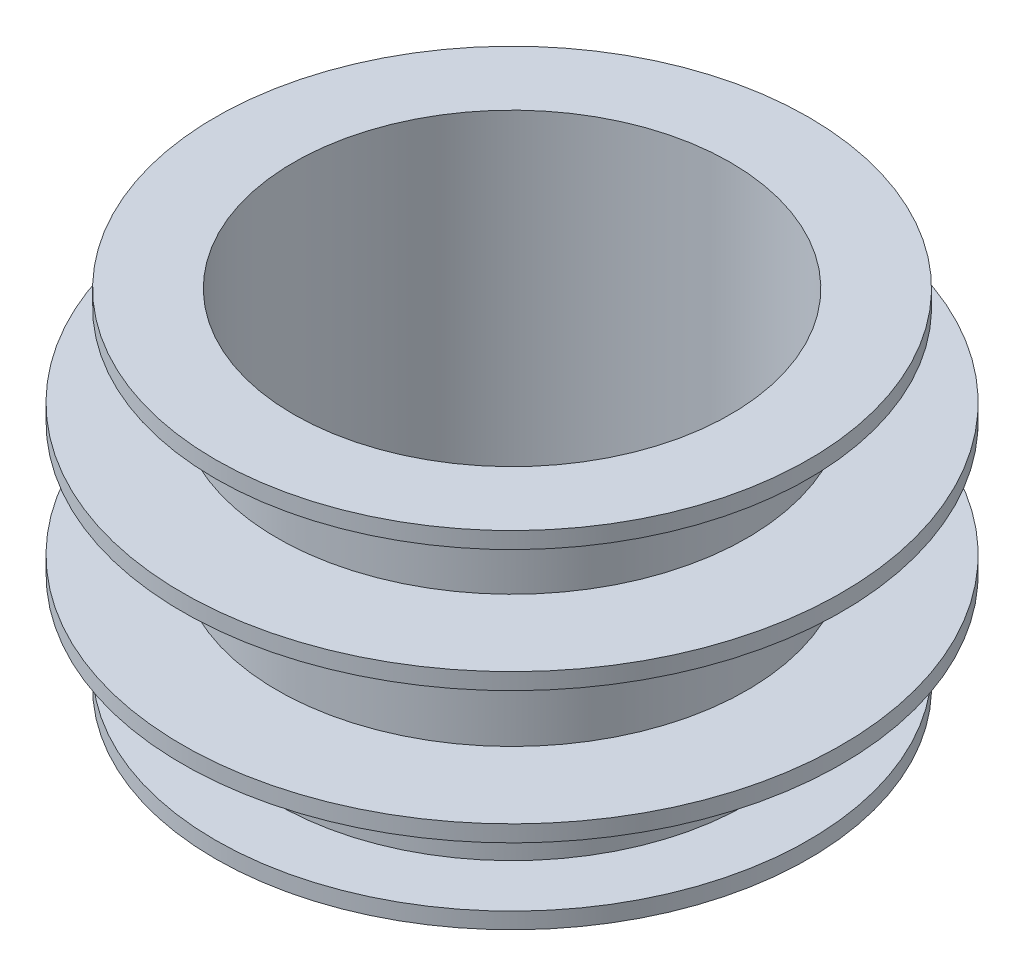
ISO-10303-21;
HEADER;
FILE_DESCRIPTION(('STEP AP214'),'2;1');
FILE_NAME('part.step','',(''),(''),'','','');
FILE_SCHEMA(('AUTOMOTIVE_DESIGN { 1 0 10303 214 1 1 1 1 }'));
ENDSEC;
DATA;
#1=APPLICATION_CONTEXT('core data for automotive mechanical design processes');
#2=APPLICATION_PROTOCOL_DEFINITION('international standard','automotive_design',2000,#1);
#3=PRODUCT_CONTEXT('',#1,'mechanical');
#4=PRODUCT('Part','Part','',(#3));
#5=PRODUCT_RELATED_PRODUCT_CATEGORY('part','',(#4));
#6=PRODUCT_DEFINITION_FORMATION('','',#4);
#7=PRODUCT_DEFINITION_CONTEXT('part definition',#1,'design');
#8=PRODUCT_DEFINITION('design','',#6,#7);
#9=PRODUCT_DEFINITION_SHAPE('','',#8);
#10=(LENGTH_UNIT() NAMED_UNIT(*) SI_UNIT(.MILLI.,.METRE.));
#11=(NAMED_UNIT(*) PLANE_ANGLE_UNIT() SI_UNIT($,.RADIAN.));
#12=(NAMED_UNIT(*) SI_UNIT($,.STERADIAN.) SOLID_ANGLE_UNIT());
#13=UNCERTAINTY_MEASURE_WITH_UNIT(LENGTH_MEASURE(1.E-05),#10,'distance_accuracy_value','');
#14=(GEOMETRIC_REPRESENTATION_CONTEXT(3) GLOBAL_UNCERTAINTY_ASSIGNED_CONTEXT((#13)) GLOBAL_UNIT_ASSIGNED_CONTEXT((#10,
#11,#12)) REPRESENTATION_CONTEXT('',''));
#15=CARTESIAN_POINT('',(0.,0.,0.));
#16=DIRECTION('',(0.,0.,1.));
#17=DIRECTION('',(1.,0.,0.));
#18=AXIS2_PLACEMENT_3D('',#15,#16,#17);
#19=CARTESIAN_POINT('',(11.881076893319,20.9799405329486,0.));
#20=DIRECTION('',(0.,1.,0.));
#21=DIRECTION('',(0.,0.,1.));
#22=AXIS2_PLACEMENT_3D('',#19,#20,#21);
#23=PLANE('',#22);
#24=CARTESIAN_POINT('',(0.,20.9799405329486,0.));
#25=DIRECTION('',(0.,1.,0.));
#26=DIRECTION('',(0.,0.,1.));
#27=AXIS2_PLACEMENT_3D('',#24,#25,#26);
#28=CIRCLE('',#27,13.25);
#29=CARTESIAN_POINT('',(0.,20.9799405329486,13.25));
#30=VERTEX_POINT('',#29);
#31=EDGE_CURVE('E107',#30,#30,#28,.T.);
#32=ORIENTED_EDGE('',*,*,#31,.F.);
#33=EDGE_LOOP('',(#32));
#34=FACE_BOUND('',#33,.T.);
#35=CARTESIAN_POINT('',(0.,20.9799405329486,0.));
#36=DIRECTION('',(0.,-1.,0.));
#37=DIRECTION('',(0.,0.,-1.));
#38=AXIS2_PLACEMENT_3D('',#35,#36,#37);
#39=CIRCLE('',#38,18.);
#40=CARTESIAN_POINT('',(0.,20.9799405329486,-18.));
#41=VERTEX_POINT('',#40);
#42=EDGE_CURVE('E10',#41,#41,#39,.T.);
#43=ORIENTED_EDGE('',*,*,#42,.F.);
#44=EDGE_LOOP('',(#43));
#45=FACE_BOUND('',#44,.T.);
#46=ADVANCED_FACE('F43',(#34,#45),#23,.T.);
#47=CARTESIAN_POINT('',(0.,0.,0.));
#48=DIRECTION('',(0.,-1.,0.));
#49=DIRECTION('',(0.,0.,-1.));
#50=AXIS2_PLACEMENT_3D('',#47,#48,#49);
#51=CYLINDRICAL_SURFACE('',#50,18.);
#52=ORIENTED_EDGE('',*,*,#42,.T.);
#53=EDGE_LOOP('',(#52));
#54=FACE_BOUND('',#53,.T.);
#55=CARTESIAN_POINT('',(0.,19.9799405329486,0.));
#56=DIRECTION('',(0.,-1.,0.));
#57=DIRECTION('',(0.,0.,-1.));
#58=AXIS2_PLACEMENT_3D('',#55,#56,#57);
#59=CIRCLE('',#58,18.);
#60=CARTESIAN_POINT('',(0.,19.9799405329486,-18.));
#61=VERTEX_POINT('',#60);
#62=EDGE_CURVE('E50',#61,#61,#59,.T.);
#63=ORIENTED_EDGE('',*,*,#62,.F.);
#64=EDGE_LOOP('',(#63));
#65=FACE_BOUND('',#64,.T.);
#66=ADVANCED_FACE('F126',(#54,#65),#51,.T.);
#67=CARTESIAN_POINT('',(18.,19.9799405329486,0.));
#68=DIRECTION('',(0.,-1.,0.));
#69=DIRECTION('',(0.,0.,-1.));
#70=AXIS2_PLACEMENT_3D('',#67,#68,#69);
#71=PLANE('',#70);
#72=ORIENTED_EDGE('',*,*,#62,.T.);
#73=EDGE_LOOP('',(#72));
#74=FACE_BOUND('',#73,.T.);
#75=CARTESIAN_POINT('',(0.,19.9799405329486,0.));
#76=DIRECTION('',(0.,-1.,0.));
#77=DIRECTION('',(0.,0.,-1.));
#78=AXIS2_PLACEMENT_3D('',#75,#76,#77);
#79=CIRCLE('',#78,14.25);
#80=CARTESIAN_POINT('',(0.,19.9799405329486,-14.25));
#81=VERTEX_POINT('',#80);
#82=EDGE_CURVE('E55',#81,#81,#79,.T.);
#83=ORIENTED_EDGE('',*,*,#82,.F.);
#84=EDGE_LOOP('',(#83));
#85=FACE_BOUND('',#84,.T.);
#86=ADVANCED_FACE('F132',(#74,#85),#71,.T.);
#87=CARTESIAN_POINT('',(0.,0.,0.));
#88=DIRECTION('',(0.,-1.,0.));
#89=DIRECTION('',(0.,0.,-1.));
#90=AXIS2_PLACEMENT_3D('',#87,#88,#89);
#91=CYLINDRICAL_SURFACE('',#90,14.25);
#92=ORIENTED_EDGE('',*,*,#82,.T.);
#93=EDGE_LOOP('',(#92));
#94=FACE_BOUND('',#93,.T.);
#95=CARTESIAN_POINT('',(0.,14.9799405329486,0.));
#96=DIRECTION('',(0.,-1.,0.));
#97=DIRECTION('',(0.,0.,-1.));
#98=AXIS2_PLACEMENT_3D('',#95,#96,#97);
#99=CIRCLE('',#98,14.25);
#100=CARTESIAN_POINT('',(0.,14.9799405329486,-14.25));
#101=VERTEX_POINT('',#100);
#102=EDGE_CURVE('E60',#101,#101,#99,.T.);
#103=ORIENTED_EDGE('',*,*,#102,.F.);
#104=EDGE_LOOP('',(#103));
#105=FACE_BOUND('',#104,.T.);
#106=ADVANCED_FACE('F136',(#94,#105),#91,.T.);
#107=CARTESIAN_POINT('',(14.25,14.9799405329486,0.));
#108=DIRECTION('',(0.,1.,0.));
#109=DIRECTION('',(0.,0.,1.));
#110=AXIS2_PLACEMENT_3D('',#107,#108,#109);
#111=PLANE('',#110);
#112=ORIENTED_EDGE('',*,*,#102,.T.);
#113=EDGE_LOOP('',(#112));
#114=FACE_BOUND('',#113,.T.);
#115=CARTESIAN_POINT('',(0.,14.9799405329486,0.));
#116=DIRECTION('',(0.,-1.,0.));
#117=DIRECTION('',(0.,0.,-1.));
#118=AXIS2_PLACEMENT_3D('',#115,#116,#117);
#119=CIRCLE('',#118,20.);
#120=CARTESIAN_POINT('',(0.,14.9799405329486,-20.));
#121=VERTEX_POINT('',#120);
#122=EDGE_CURVE('E66',#121,#121,#119,.T.);
#123=ORIENTED_EDGE('',*,*,#122,.F.);
#124=EDGE_LOOP('',(#123));
#125=FACE_BOUND('',#124,.T.);
#126=ADVANCED_FACE('F142',(#114,#125),#111,.T.);
#127=CARTESIAN_POINT('',(0.,0.,0.));
#128=DIRECTION('',(0.,-1.,0.));
#129=DIRECTION('',(0.,0.,-1.));
#130=AXIS2_PLACEMENT_3D('',#127,#128,#129);
#131=CYLINDRICAL_SURFACE('',#130,20.);
#132=ORIENTED_EDGE('',*,*,#122,.T.);
#133=EDGE_LOOP('',(#132));
#134=FACE_BOUND('',#133,.T.);
#135=CARTESIAN_POINT('',(0.,13.9799405329486,0.));
#136=DIRECTION('',(0.,-1.,0.));
#137=DIRECTION('',(0.,0.,-1.));
#138=AXIS2_PLACEMENT_3D('',#135,#136,#137);
#139=CIRCLE('',#138,20.);
#140=CARTESIAN_POINT('',(0.,13.9799405329486,-20.));
#141=VERTEX_POINT('',#140);
#142=EDGE_CURVE('E70',#141,#141,#139,.T.);
#143=ORIENTED_EDGE('',*,*,#142,.F.);
#144=EDGE_LOOP('',(#143));
#145=FACE_BOUND('',#144,.T.);
#146=ADVANCED_FACE('F146',(#134,#145),#131,.T.);
#147=CARTESIAN_POINT('',(20.,13.9799405329486,0.));
#148=DIRECTION('',(0.,-1.,0.));
#149=DIRECTION('',(0.,0.,-1.));
#150=AXIS2_PLACEMENT_3D('',#147,#148,#149);
#151=PLANE('',#150);
#152=ORIENTED_EDGE('',*,*,#142,.T.);
#153=EDGE_LOOP('',(#152));
#154=FACE_BOUND('',#153,.T.);
#155=CARTESIAN_POINT('',(0.,13.9799405329486,0.));
#156=DIRECTION('',(0.,-1.,0.));
#157=DIRECTION('',(0.,0.,-1.));
#158=AXIS2_PLACEMENT_3D('',#155,#156,#157);
#159=CIRCLE('',#158,14.25);
#160=CARTESIAN_POINT('',(0.,13.9799405329486,-14.25));
#161=VERTEX_POINT('',#160);
#162=EDGE_CURVE('E74',#161,#161,#159,.T.);
#163=ORIENTED_EDGE('',*,*,#162,.F.);
#164=EDGE_LOOP('',(#163));
#165=FACE_BOUND('',#164,.T.);
#166=ADVANCED_FACE('F150',(#154,#165),#151,.T.);
#167=CARTESIAN_POINT('',(0.,0.,0.));
#168=DIRECTION('',(0.,-1.,0.));
#169=DIRECTION('',(0.,0.,-1.));
#170=AXIS2_PLACEMENT_3D('',#167,#168,#169);
#171=CYLINDRICAL_SURFACE('',#170,14.25);
#172=ORIENTED_EDGE('',*,*,#162,.T.);
#173=EDGE_LOOP('',(#172));
#174=FACE_BOUND('',#173,.T.);
#175=CARTESIAN_POINT('',(0.,6.97994053294864,0.));
#176=DIRECTION('',(0.,-1.,0.));
#177=DIRECTION('',(0.,0.,-1.));
#178=AXIS2_PLACEMENT_3D('',#175,#176,#177);
#179=CIRCLE('',#178,14.25);
#180=CARTESIAN_POINT('',(0.,6.97994053294864,-14.25));
#181=VERTEX_POINT('',#180);
#182=EDGE_CURVE('E78',#181,#181,#179,.T.);
#183=ORIENTED_EDGE('',*,*,#182,.F.);
#184=EDGE_LOOP('',(#183));
#185=FACE_BOUND('',#184,.T.);
#186=ADVANCED_FACE('F154',(#174,#185),#171,.T.);
#187=CARTESIAN_POINT('',(14.25,6.97994053294864,0.));
#188=DIRECTION('',(0.,1.,0.));
#189=DIRECTION('',(0.,0.,1.));
#190=AXIS2_PLACEMENT_3D('',#187,#188,#189);
#191=PLANE('',#190);
#192=ORIENTED_EDGE('',*,*,#182,.T.);
#193=EDGE_LOOP('',(#192));
#194=FACE_BOUND('',#193,.T.);
#195=CARTESIAN_POINT('',(0.,6.97994053294864,0.));
#196=DIRECTION('',(0.,-1.,0.));
#197=DIRECTION('',(0.,0.,-1.));
#198=AXIS2_PLACEMENT_3D('',#195,#196,#197);
#199=CIRCLE('',#198,20.);
#200=CARTESIAN_POINT('',(0.,6.97994053294864,-20.));
#201=VERTEX_POINT('',#200);
#202=EDGE_CURVE('E82',#201,#201,#199,.T.);
#203=ORIENTED_EDGE('',*,*,#202,.F.);
#204=EDGE_LOOP('',(#203));
#205=FACE_BOUND('',#204,.T.);
#206=ADVANCED_FACE('F158',(#194,#205),#191,.T.);
#207=CARTESIAN_POINT('',(0.,0.,0.));
#208=DIRECTION('',(0.,-1.,0.));
#209=DIRECTION('',(0.,0.,-1.));
#210=AXIS2_PLACEMENT_3D('',#207,#208,#209);
#211=CYLINDRICAL_SURFACE('',#210,20.);
#212=ORIENTED_EDGE('',*,*,#202,.T.);
#213=EDGE_LOOP('',(#212));
#214=FACE_BOUND('',#213,.T.);
#215=CARTESIAN_POINT('',(0.,5.97994053294864,0.));
#216=DIRECTION('',(0.,-1.,0.));
#217=DIRECTION('',(0.,0.,-1.));
#218=AXIS2_PLACEMENT_3D('',#215,#216,#217);
#219=CIRCLE('',#218,20.);
#220=CARTESIAN_POINT('',(0.,5.97994053294864,-20.));
#221=VERTEX_POINT('',#220);
#222=EDGE_CURVE('E86',#221,#221,#219,.T.);
#223=ORIENTED_EDGE('',*,*,#222,.F.);
#224=EDGE_LOOP('',(#223));
#225=FACE_BOUND('',#224,.T.);
#226=ADVANCED_FACE('F162',(#214,#225),#211,.T.);
#227=CARTESIAN_POINT('',(20.,5.97994053294864,0.));
#228=DIRECTION('',(0.,-1.,0.));
#229=DIRECTION('',(0.,0.,-1.));
#230=AXIS2_PLACEMENT_3D('',#227,#228,#229);
#231=PLANE('',#230);
#232=ORIENTED_EDGE('',*,*,#222,.T.);
#233=EDGE_LOOP('',(#232));
#234=FACE_BOUND('',#233,.T.);
#235=CARTESIAN_POINT('',(0.,5.97994053294864,0.));
#236=DIRECTION('',(0.,-1.,0.));
#237=DIRECTION('',(0.,0.,-1.));
#238=AXIS2_PLACEMENT_3D('',#235,#236,#237);
#239=CIRCLE('',#238,14.25);
#240=CARTESIAN_POINT('',(0.,5.97994053294864,-14.25));
#241=VERTEX_POINT('',#240);
#242=EDGE_CURVE('E90',#241,#241,#239,.T.);
#243=ORIENTED_EDGE('',*,*,#242,.F.);
#244=EDGE_LOOP('',(#243));
#245=FACE_BOUND('',#244,.T.);
#246=ADVANCED_FACE('F166',(#234,#245),#231,.T.);
#247=CARTESIAN_POINT('',(0.,0.,0.));
#248=DIRECTION('',(0.,-1.,0.));
#249=DIRECTION('',(0.,0.,-1.));
#250=AXIS2_PLACEMENT_3D('',#247,#248,#249);
#251=CYLINDRICAL_SURFACE('',#250,14.25);
#252=ORIENTED_EDGE('',*,*,#242,.T.);
#253=EDGE_LOOP('',(#252));
#254=FACE_BOUND('',#253,.T.);
#255=CARTESIAN_POINT('',(0.,0.979940532948639,0.));
#256=DIRECTION('',(0.,-1.,0.));
#257=DIRECTION('',(0.,0.,-1.));
#258=AXIS2_PLACEMENT_3D('',#255,#256,#257);
#259=CIRCLE('',#258,14.25);
#260=CARTESIAN_POINT('',(0.,0.979940532948639,-14.25));
#261=VERTEX_POINT('',#260);
#262=EDGE_CURVE('E94',#261,#261,#259,.T.);
#263=ORIENTED_EDGE('',*,*,#262,.F.);
#264=EDGE_LOOP('',(#263));
#265=FACE_BOUND('',#264,.T.);
#266=ADVANCED_FACE('F170',(#254,#265),#251,.T.);
#267=CARTESIAN_POINT('',(14.25,0.979940532948639,0.));
#268=DIRECTION('',(0.,1.,0.));
#269=DIRECTION('',(0.,0.,1.));
#270=AXIS2_PLACEMENT_3D('',#267,#268,#269);
#271=PLANE('',#270);
#272=ORIENTED_EDGE('',*,*,#262,.T.);
#273=EDGE_LOOP('',(#272));
#274=FACE_BOUND('',#273,.T.);
#275=CARTESIAN_POINT('',(0.,0.979940532948639,0.));
#276=DIRECTION('',(0.,-1.,0.));
#277=DIRECTION('',(0.,0.,-1.));
#278=AXIS2_PLACEMENT_3D('',#275,#276,#277);
#279=CIRCLE('',#278,18.);
#280=CARTESIAN_POINT('',(0.,0.979940532948639,-18.));
#281=VERTEX_POINT('',#280);
#282=EDGE_CURVE('E98',#281,#281,#279,.T.);
#283=ORIENTED_EDGE('',*,*,#282,.F.);
#284=EDGE_LOOP('',(#283));
#285=FACE_BOUND('',#284,.T.);
#286=ADVANCED_FACE('F174',(#274,#285),#271,.T.);
#287=CARTESIAN_POINT('',(0.,0.,0.));
#288=DIRECTION('',(0.,-1.,0.));
#289=DIRECTION('',(0.,0.,-1.));
#290=AXIS2_PLACEMENT_3D('',#287,#288,#289);
#291=CYLINDRICAL_SURFACE('',#290,18.);
#292=ORIENTED_EDGE('',*,*,#282,.T.);
#293=EDGE_LOOP('',(#292));
#294=FACE_BOUND('',#293,.T.);
#295=CARTESIAN_POINT('',(0.,0.,0.));
#296=DIRECTION('',(0.,-1.,0.));
#297=DIRECTION('',(0.,0.,-1.));
#298=AXIS2_PLACEMENT_3D('',#295,#296,#297);
#299=CIRCLE('',#298,18.);
#300=CARTESIAN_POINT('',(0.,0.,-18.));
#301=VERTEX_POINT('',#300);
#302=EDGE_CURVE('E102',#301,#301,#299,.T.);
#303=ORIENTED_EDGE('',*,*,#302,.F.);
#304=EDGE_LOOP('',(#303));
#305=FACE_BOUND('',#304,.T.);
#306=ADVANCED_FACE('F178',(#294,#305),#291,.T.);
#307=CARTESIAN_POINT('',(0.,0.,0.));
#308=DIRECTION('',(0.,-1.,0.));
#309=DIRECTION('',(0.,0.,-1.));
#310=AXIS2_PLACEMENT_3D('',#307,#308,#309);
#311=PLANE('',#310);
#312=CARTESIAN_POINT('',(0.,0.,0.));
#313=DIRECTION('',(0.,1.,0.));
#314=DIRECTION('',(0.,0.,1.));
#315=AXIS2_PLACEMENT_3D('',#312,#313,#314);
#316=CIRCLE('',#315,13.25);
#317=CARTESIAN_POINT('',(0.,0.,13.25));
#318=VERTEX_POINT('',#317);
#319=EDGE_CURVE('E106',#318,#318,#316,.T.);
#320=ORIENTED_EDGE('',*,*,#319,.T.);
#321=EDGE_LOOP('',(#320));
#322=FACE_BOUND('',#321,.T.);
#323=ORIENTED_EDGE('',*,*,#302,.T.);
#324=EDGE_LOOP('',(#323));
#325=FACE_BOUND('',#324,.T.);
#326=ADVANCED_FACE('F115',(#322,#325),#311,.T.);
#327=CARTESIAN_POINT('',(0.,0.,0.));
#328=DIRECTION('',(0.,1.,0.));
#329=DIRECTION('',(0.,0.,1.));
#330=AXIS2_PLACEMENT_3D('',#327,#328,#329);
#331=CYLINDRICAL_SURFACE('',#330,13.25);
#332=ORIENTED_EDGE('',*,*,#319,.F.);
#333=EDGE_LOOP('',(#332));
#334=FACE_BOUND('',#333,.T.);
#335=ORIENTED_EDGE('',*,*,#31,.T.);
#336=EDGE_LOOP('',(#335));
#337=FACE_BOUND('',#336,.T.);
#338=ADVANCED_FACE('F118',(#334,#337),#331,.F.);
#339=CLOSED_SHELL('',(#46,#66,#86,#106,#126,#146,#166,#186,#206,#226,#246,#266,#286,#306,#326,#338));
#340=MANIFOLD_SOLID_BREP('B2',#339);
#341=ADVANCED_BREP_SHAPE_REPRESENTATION('',(#18,#340),#14);
#342=SHAPE_DEFINITION_REPRESENTATION(#9,#341);
ENDSEC;
END-ISO-10303-21;
